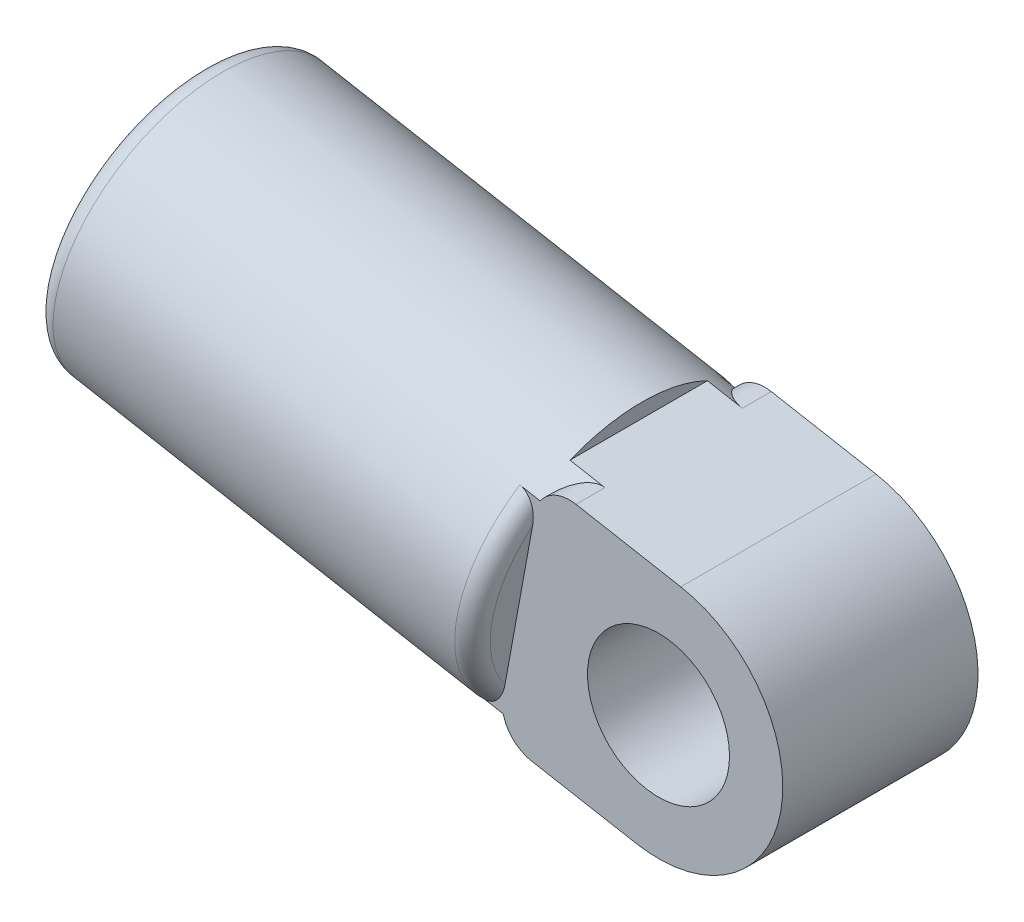
ISO-10303-21;
HEADER;
FILE_DESCRIPTION(('STEP AP214'),'2;1');
FILE_NAME('part.step','',(''),(''),'','','');
FILE_SCHEMA(('AUTOMOTIVE_DESIGN { 1 0 10303 214 1 1 1 1 }'));
ENDSEC;
DATA;
#1=APPLICATION_CONTEXT('core data for automotive mechanical design processes');
#2=APPLICATION_PROTOCOL_DEFINITION('international standard','automotive_design',2000,#1);
#3=PRODUCT_CONTEXT('',#1,'mechanical');
#4=PRODUCT('Part','Part','',(#3));
#5=PRODUCT_RELATED_PRODUCT_CATEGORY('part','',(#4));
#6=PRODUCT_DEFINITION_FORMATION('','',#4);
#7=PRODUCT_DEFINITION_CONTEXT('part definition',#1,'design');
#8=PRODUCT_DEFINITION('design','',#6,#7);
#9=PRODUCT_DEFINITION_SHAPE('','',#8);
#10=(LENGTH_UNIT() NAMED_UNIT(*) SI_UNIT(.MILLI.,.METRE.));
#11=(NAMED_UNIT(*) PLANE_ANGLE_UNIT() SI_UNIT($,.RADIAN.));
#12=(NAMED_UNIT(*) SI_UNIT($,.STERADIAN.) SOLID_ANGLE_UNIT());
#13=UNCERTAINTY_MEASURE_WITH_UNIT(LENGTH_MEASURE(1.E-05),#10,'distance_accuracy_value','');
#14=(GEOMETRIC_REPRESENTATION_CONTEXT(3) GLOBAL_UNCERTAINTY_ASSIGNED_CONTEXT((#13)) GLOBAL_UNIT_ASSIGNED_CONTEXT((#10,
#11,#12)) REPRESENTATION_CONTEXT('',''));
#15=CARTESIAN_POINT('',(0.,0.,0.));
#16=DIRECTION('',(0.,0.,1.));
#17=DIRECTION('',(1.,0.,0.));
#18=AXIS2_PLACEMENT_3D('',#15,#16,#17);
#19=CARTESIAN_POINT('',(178.5,-22.5,5.5));
#20=DIRECTION('',(0.,0.,1.));
#21=DIRECTION('',(1.,0.,0.));
#22=AXIS2_PLACEMENT_3D('',#19,#20,#21);
#23=PLANE('',#22);
#24=DIRECTION('',(0.983797004614952,-0.17928595514052,0.));
#25=VECTOR('',#24,1.);
#26=CARTESIAN_POINT('',(147.076256125409,-10.8682193579792,5.5));
#27=LINE('',#26,#25);
#28=CARTESIAN_POINT('',(171.839542532962,-15.3810501911388,5.5));
#29=VERTEX_POINT('',#28);
#30=CARTESIAN_POINT('',(170.687384236168,-15.1710822813516,5.5));
#31=VERTEX_POINT('',#30);
#32=EDGE_CURVE('E247',#29,#31,#27,.F.);
#33=ORIENTED_EDGE('',*,*,#32,.T.);
#34=CARTESIAN_POINT('',(170.687384236168,-15.1710822813516,5.5));
#35=CARTESIAN_POINT('',(170.709567359835,-15.1751215703482,5.5));
#36=CARTESIAN_POINT('',(170.731547850937,-15.1801989718356,5.5));
#37=CARTESIAN_POINT('',(170.774933255146,-15.1923569855984,5.5));
#38=CARTESIAN_POINT('',(170.796338518701,-15.1994363464552,5.5));
#39=CARTESIAN_POINT('',(170.859131176657,-15.2234450997885,5.5));
#40=CARTESIAN_POINT('',(170.899465360551,-15.2432141598107,5.5));
#41=CARTESIAN_POINT('',(170.976052950081,-15.2892446428313,5.5));
#42=CARTESIAN_POINT('',(171.012314804377,-15.3154922490106,5.5));
#43=CARTESIAN_POINT('',(171.080367049019,-15.3733234521363,5.5));
#44=CARTESIAN_POINT('',(171.112148711703,-15.4049172073886,5.5));
#45=CARTESIAN_POINT('',(171.18141875032,-15.484189241525,5.5));
#46=CARTESIAN_POINT('',(171.216927352727,-15.5335957829678,5.5));
#47=CARTESIAN_POINT('',(171.279476447794,-15.6374602713463,5.5));
#48=CARTESIAN_POINT('',(171.306505479679,-15.6919249270263,5.5));
#49=CARTESIAN_POINT('',(171.361968757601,-15.8263614317351,5.5));
#50=CARTESIAN_POINT('',(171.386683763869,-15.9078603787864,5.5));
#51=CARTESIAN_POINT('',(171.423034939564,-16.0738589253638,5.5));
#52=CARTESIAN_POINT('',(171.434619708439,-16.1583689908957,5.5));
#53=CARTESIAN_POINT('',(171.447226091329,-16.3377569067436,5.5));
#54=CARTESIAN_POINT('',(171.446903190216,-16.432725247939,5.5));
#55=CARTESIAN_POINT('',(171.43765017602,-16.573960631156,5.5));
#56=CARTESIAN_POINT('',(171.433151820406,-16.6205878912566,5.5));
#57=CARTESIAN_POINT('',(171.421494800532,-16.7134638675888,5.5));
#58=CARTESIAN_POINT('',(171.414338761282,-16.7597129114734,5.5));
#59=CARTESIAN_POINT('',(171.405954921548,-16.8057463680579,5.5));
#60=B_SPLINE_CURVE_WITH_KNOTS('',3,(#34,#35,#36,#37,#38,#39,#40,#41,#42,#43,#44,#45,#46,#47,#48,
#49,#50,#51,#52,#53,#54,#55,#56,#57,#58,#59),.UNSPECIFIED.,.F.,.F.,(4,2,2,2,2,2,2,2,2,2,2,2,4),
(0.,0.0675937326948276,0.135145305806319,0.269136656450125,0.40284467570211,0.536809668807584,
0.71833519593357,0.900105021834613,1.15419219100256,1.40927062890769,1.69323005857285,
1.83370200602132,1.97403557580748),.UNSPECIFIED.);
#61=CARTESIAN_POINT('',(171.405954921548,-16.8057463680579,5.5));
#62=VERTEX_POINT('',#61);
#63=EDGE_CURVE('E29',#31,#62,#60,.T.);
#64=ORIENTED_EDGE('',*,*,#63,.T.);
#65=DIRECTION('',(-0.17928595514052,-0.983797004614952,0.));
#66=VECTOR('',#65,1.);
#67=CARTESIAN_POINT('',(171.884625649064,-14.1791333265712,5.5));
#68=LINE('',#67,#66);
#69=CARTESIAN_POINT('',(169.853293004614,-25.3256783496938,5.5));
#70=VERTEX_POINT('',#69);
#71=EDGE_CURVE('E131',#62,#70,#68,.T.);
#72=ORIENTED_EDGE('',*,*,#71,.T.);
#73=CARTESIAN_POINT('',(169.853293004614,-25.3256783496938,5.5));
#74=CARTESIAN_POINT('',(169.841787573011,-25.3887267518417,5.5));
#75=CARTESIAN_POINT('',(169.827982658226,-25.4514010937866,5.5));
#76=CARTESIAN_POINT('',(169.795309762543,-25.575667432973,5.5));
#77=CARTESIAN_POINT('',(169.776422427294,-25.6372543132943,5.5));
#78=CARTESIAN_POINT('',(169.732901757257,-25.7593611973962,5.5));
#79=CARTESIAN_POINT('',(169.708191944323,-25.8198543349024,5.5));
#80=CARTESIAN_POINT('',(169.65273348222,-25.9379057792074,5.5));
#81=CARTESIAN_POINT('',(169.621995605618,-25.9954690939858,5.5));
#82=CARTESIAN_POINT('',(169.552355027426,-26.1092369806614,5.5));
#83=CARTESIAN_POINT('',(169.513137037447,-26.1652512497782,5.5));
#84=CARTESIAN_POINT('',(169.427146042742,-26.270908078276,5.5));
#85=CARTESIAN_POINT('',(169.380403625634,-26.3205750324999,5.5));
#86=CARTESIAN_POINT('',(169.288256602677,-26.4030732276517,5.5));
#87=CARTESIAN_POINT('',(169.24413282431,-26.4373251936279,5.5));
#88=CARTESIAN_POINT('',(169.150870614628,-26.4982662177577,5.5));
#89=CARTESIAN_POINT('',(169.101735395743,-26.5249600798722,5.5));
#90=CARTESIAN_POINT('',(169.00917672196,-26.5645674257359,5.5));
#91=CARTESIAN_POINT('',(168.966466335461,-26.5791422714267,5.5));
#92=CARTESIAN_POINT('',(168.879246364398,-26.6009983368129,5.5));
#93=CARTESIAN_POINT('',(168.834740432944,-26.60829365837,5.5));
#94=CARTESIAN_POINT('',(168.758992674265,-26.6138412986366,5.5));
#95=CARTESIAN_POINT('',(168.727894366258,-26.6141889966035,5.5));
#96=CARTESIAN_POINT('',(168.66584032446,-26.6109573254354,5.5));
#97=CARTESIAN_POINT('',(168.634885017544,-26.6073698476432,5.5));
#98=CARTESIAN_POINT('',(168.604269680764,-26.601770526119,5.5));
#99=B_SPLINE_CURVE_WITH_KNOTS('',3,(#73,#74,#75,#76,#77,#78,#79,#80,#81,#82,#83,#84,#85,#86,#87,
#88,#89,#90,#91,#92,#93,#94,#95,#96,#97,#98),.UNSPECIFIED.,.F.,.F.,(4,2,2,2,2,2,2,2,2,2,2,2,4),
(0.,0.192293227419892,0.385329350833492,0.581058216288106,0.776440436753517,0.980984952802256,
1.18471804862729,1.35168489083902,1.51854536880083,1.65338885619145,1.78797061528234,
1.88103612266413,1.97429375774677),.UNSPECIFIED.);
#100=CARTESIAN_POINT('',(168.604269680764,-26.601770526119,5.5));
#101=VERTEX_POINT('',#100);
#102=EDGE_CURVE('E11',#70,#101,#99,.T.);
#103=ORIENTED_EDGE('',*,*,#102,.T.);
#104=DIRECTION('',(0.983797004614952,-0.17928595514052,0.));
#105=VECTOR('',#104,1.);
#106=CARTESIAN_POINT('',(144.993141570004,-22.2989076027465,5.5));
#107=LINE('',#106,#105);
#108=CARTESIAN_POINT('',(169.756427977558,-26.8117384359061,5.5));
#109=VERTEX_POINT('',#108);
#110=EDGE_CURVE('E249',#109,#101,#107,.F.);
#111=ORIENTED_EDGE('',*,*,#110,.F.);
#112=CARTESIAN_POINT('',(171.700788196608,-26.3432692922316,5.5));
#113=DIRECTION('',(0.,0.,1.));
#114=DIRECTION('',(1.,0.,0.));
#115=AXIS2_PLACEMENT_3D('',#112,#113,#114);
#116=CIRCLE('',#115,2.);
#117=CARTESIAN_POINT('',(171.342216286327,-28.3108633014615,5.5));
#118=VERTEX_POINT('',#117);
#119=EDGE_CURVE('E127',#109,#118,#116,.T.);
#120=ORIENTED_EDGE('',*,*,#119,.T.);
#121=DIRECTION('',(0.983797004614952,-0.179285955140521,0.));
#122=VECTOR('',#121,1.);
#123=CARTESIAN_POINT('',(169.374622277097,-27.9522913911805,5.5));
#124=LINE('',#123,#122);
#125=CARTESIAN_POINT('',(177.244998314017,-29.3865790323046,5.5));
#126=VERTEX_POINT('',#125);
#127=EDGE_CURVE('E119',#118,#126,#124,.T.);
#128=ORIENTED_EDGE('',*,*,#127,.T.);
#129=CARTESIAN_POINT('',(178.5,-22.5,5.5));
#130=DIRECTION('',(0.,0.,1.));
#131=DIRECTION('',(1.,0.,0.));
#132=AXIS2_PLACEMENT_3D('',#129,#130,#131);
#133=CIRCLE('',#132,7.);
#134=CARTESIAN_POINT('',(179.755001685984,-15.6134209676954,5.5));
#135=VERTEX_POINT('',#134);
#136=EDGE_CURVE('E124',#126,#135,#133,.T.);
#137=ORIENTED_EDGE('',*,*,#136,.T.);
#138=DIRECTION('',(-0.983797004614952,0.179285955140521,0.));
#139=VECTOR('',#138,1.);
#140=CARTESIAN_POINT('',(171.884625649064,-14.1791333265712,5.5));
#141=LINE('',#140,#139);
#142=CARTESIAN_POINT('',(173.852219658294,-14.5377052368522,5.5));
#143=VERTEX_POINT('',#142);
#144=EDGE_CURVE('E148',#135,#143,#141,.T.);
#145=ORIENTED_EDGE('',*,*,#144,.T.);
#146=CARTESIAN_POINT('',(173.493647748013,-16.5052992460821,5.5));
#147=DIRECTION('',(0.,0.,1.));
#148=DIRECTION('',(1.,0.,0.));
#149=AXIS2_PLACEMENT_3D('',#146,#147,#148);
#150=CIRCLE('',#149,2.);
#151=EDGE_CURVE('E182',#143,#29,#150,.T.);
#152=ORIENTED_EDGE('',*,*,#151,.T.);
#153=EDGE_LOOP('',(#33,#64,#72,#103,#111,#120,#128,#137,#145,#152));
#154=FACE_BOUND('',#153,.T.);
#155=CARTESIAN_POINT('',(178.5,-22.5,5.5));
#156=DIRECTION('',(0.,0.,1.));
#157=DIRECTION('',(1.,0.,0.));
#158=AXIS2_PLACEMENT_3D('',#155,#156,#157);
#159=CIRCLE('',#158,4.);
#160=CARTESIAN_POINT('',(182.5,-22.5,5.5));
#161=VERTEX_POINT('',#160);
#162=EDGE_CURVE('E157',#161,#161,#159,.T.);
#163=ORIENTED_EDGE('',*,*,#162,.F.);
#164=EDGE_LOOP('',(#163));
#165=FACE_BOUND('',#164,.T.);
#166=ADVANCED_FACE('F17',(#154,#165),#23,.T.);
#167=CARTESIAN_POINT('',(178.5,-22.5,-5.5));
#168=DIRECTION('',(0.,0.,1.));
#169=DIRECTION('',(1.,0.,0.));
#170=AXIS2_PLACEMENT_3D('',#167,#168,#169);
#171=PLANE('',#170);
#172=DIRECTION('',(0.983797004614952,-0.179285955140521,0.));
#173=VECTOR('',#172,1.);
#174=CARTESIAN_POINT('',(169.374622277097,-27.9522913911805,-5.5));
#175=LINE('',#174,#173);
#176=CARTESIAN_POINT('',(171.342216286327,-28.3108633014615,-5.5));
#177=VERTEX_POINT('',#176);
#178=CARTESIAN_POINT('',(177.244998314017,-29.3865790323046,-5.5));
#179=VERTEX_POINT('',#178);
#180=EDGE_CURVE('E139',#177,#179,#175,.T.);
#181=ORIENTED_EDGE('',*,*,#180,.F.);
#182=CARTESIAN_POINT('',(171.700788196608,-26.3432692922316,-5.5));
#183=DIRECTION('',(0.,0.,1.));
#184=DIRECTION('',(1.,0.,0.));
#185=AXIS2_PLACEMENT_3D('',#182,#183,#184);
#186=CIRCLE('',#185,2.);
#187=CARTESIAN_POINT('',(169.756427977558,-26.8117384359061,-5.5));
#188=VERTEX_POINT('',#187);
#189=EDGE_CURVE('E179',#177,#188,#186,.F.);
#190=ORIENTED_EDGE('',*,*,#189,.T.);
#191=DIRECTION('',(0.983797004614952,-0.17928595514052,0.));
#192=VECTOR('',#191,1.);
#193=CARTESIAN_POINT('',(144.993141570004,-22.2989076027465,-5.5));
#194=LINE('',#193,#192);
#195=CARTESIAN_POINT('',(168.604269680764,-26.601770526119,-5.5));
#196=VERTEX_POINT('',#195);
#197=EDGE_CURVE('E251',#188,#196,#194,.F.);
#198=ORIENTED_EDGE('',*,*,#197,.T.);
#199=CARTESIAN_POINT('',(168.604269680764,-26.601770526119,-5.5));
#200=CARTESIAN_POINT('',(168.626451627562,-26.6058162729541,-5.5));
#201=CARTESIAN_POINT('',(168.648810175025,-26.6088191632768,-5.5));
#202=CARTESIAN_POINT('',(168.693695350672,-26.6127474713324,-5.5));
#203=CARTESIAN_POINT('',(168.716221865322,-26.613674183659,-5.5));
#204=CARTESIAN_POINT('',(168.783447152643,-26.6133597406306,-5.5));
#205=CARTESIAN_POINT('',(168.828162149175,-26.6090899385601,-5.5));
#206=CARTESIAN_POINT('',(168.916063963355,-26.5930358019974,-5.5));
#207=CARTESIAN_POINT('',(168.959253812479,-26.5812673764504,-5.5));
#208=CARTESIAN_POINT('',(169.043331837986,-26.5511602064955,-5.5));
#209=CARTESIAN_POINT('',(169.084215431245,-26.5328088780408,-5.5));
#210=CARTESIAN_POINT('',(169.176996472331,-26.4830688331965,-5.5));
#211=CARTESIAN_POINT('',(169.227651085456,-26.4493645700919,-5.5));
#212=CARTESIAN_POINT('',(169.322818534305,-26.3742421505395,-5.5));
#213=CARTESIAN_POINT('',(169.367323012622,-26.3328136737061,-5.5));
#214=CARTESIAN_POINT('',(169.466644814343,-26.2265850113827,-5.5));
#215=CARTESIAN_POINT('',(169.51852069851,-26.1590438939266,-5.5));
#216=CARTESIAN_POINT('',(169.611092944058,-26.0165401929415,-5.5));
#217=CARTESIAN_POINT('',(169.651744901278,-25.9415496840739,-5.5));
#218=CARTESIAN_POINT('',(169.726822093616,-25.7781411150434,-5.5));
#219=CARTESIAN_POINT('',(169.760021170065,-25.689164087573,-5.5));
#220=CARTESIAN_POINT('',(169.801185475733,-25.5537441788335,-5.5));
#221=CARTESIAN_POINT('',(169.813424629678,-25.5085275922925,-5.5));
#222=CARTESIAN_POINT('',(169.835280116056,-25.4175101719422,-5.5));
#223=CARTESIAN_POINT('',(169.84489902033,-25.3717099575481,-5.5));
#224=CARTESIAN_POINT('',(169.853293004614,-25.3256783496937,-5.5));
#225=B_SPLINE_CURVE_WITH_KNOTS('',3,(#199,#200,#201,#202,#203,#204,#205,#206,#207,#208,#209,
#210,#211,#212,#213,#214,#215,#216,#217,#218,#219,#220,#221,#222,#223,#224),.UNSPECIFIED.,.F.,
.F.,(4,2,2,2,2,2,2,2,2,2,2,2,4),(0.,0.0675937326948768,0.135145305806379,0.26913665645022,
0.402844675702174,0.53680966880762,0.718335195933712,0.900105021834838,1.1541921910027,
1.40927062890778,1.69323005857308,1.83370200602159,1.97403557580778),.UNSPECIFIED.);
#226=CARTESIAN_POINT('',(169.853293004614,-25.3256783496937,-5.5));
#227=VERTEX_POINT('',#226);
#228=EDGE_CURVE('E268',#196,#227,#225,.T.);
#229=ORIENTED_EDGE('',*,*,#228,.T.);
#230=DIRECTION('',(-0.17928595514052,-0.983797004614952,0.));
#231=VECTOR('',#230,1.);
#232=CARTESIAN_POINT('',(171.884625649064,-14.1791333265712,-5.5));
#233=LINE('',#232,#231);
#234=CARTESIAN_POINT('',(171.405954921548,-16.8057463680579,-5.5));
#235=VERTEX_POINT('',#234);
#236=EDGE_CURVE('E154',#235,#227,#233,.T.);
#237=ORIENTED_EDGE('',*,*,#236,.F.);
#238=CARTESIAN_POINT('',(171.405954921548,-16.8057463680579,-5.5));
#239=CARTESIAN_POINT('',(171.417430217189,-16.7426924739694,-5.5));
#240=CARTESIAN_POINT('',(171.426621902096,-16.6791774226902,-5.5));
#241=CARTESIAN_POINT('',(171.439885884607,-16.5513740270584,-5.5));
#242=CARTESIAN_POINT('',(171.443938267038,-16.4870836431962,-5.5));
#243=CARTESIAN_POINT('',(171.446290071428,-16.3574741956946,-5.5));
#244=CARTESIAN_POINT('',(171.444508454385,-16.2921532925983,-5.5));
#245=CARTESIAN_POINT('',(171.434259305506,-16.162127374149,-5.5));
#246=CARTESIAN_POINT('',(171.425803620326,-16.0974214729159,-5.5));
#247=CARTESIAN_POINT('',(171.400773003508,-15.966400824195,-5.5));
#248=CARTESIAN_POINT('',(171.383835920813,-15.9001529237568,-5.5));
#249=CARTESIAN_POINT('',(171.340644732324,-15.7709540932072,-5.5));
#250=CARTESIAN_POINT('',(171.314427853336,-15.7079911266702,-5.5));
#251=CARTESIAN_POINT('',(171.25730690346,-15.598290519887,-5.5));
#252=CARTESIAN_POINT('',(171.228102497387,-15.55067531584,-5.5));
#253=CARTESIAN_POINT('',(171.162333502547,-15.4607526407536,-5.5));
#254=CARTESIAN_POINT('',(171.125773614351,-15.4184418078088,-5.5));
#255=CARTESIAN_POINT('',(171.053137216864,-15.3487295154997,-5.5));
#256=CARTESIAN_POINT('',(171.018314000325,-15.3200250414294,-5.5));
#257=CARTESIAN_POINT('',(170.944411120176,-15.2688061459683,-5.5));
#258=CARTESIAN_POINT('',(170.905339849431,-15.24627981796,-5.5));
#259=CARTESIAN_POINT('',(170.836418676418,-15.2143678896583,-5.5));
#260=CARTESIAN_POINT('',(170.807442237079,-15.2030722436825,-5.5));
#261=CARTESIAN_POINT('',(170.74823744703,-15.1842058545957,-5.5));
#262=CARTESIAN_POINT('',(170.718006635325,-15.1766428494457,-5.5));
#263=CARTESIAN_POINT('',(170.687384236168,-15.1710822813516,-5.5));
#264=B_SPLINE_CURVE_WITH_KNOTS('',3,(#238,#239,#240,#241,#242,#243,#244,#245,#246,#247,#248,
#249,#250,#251,#252,#253,#254,#255,#256,#257,#258,#259,#260,#261,#262,#263),.UNSPECIFIED.,.F.,
.F.,(4,2,2,2,2,2,2,2,2,2,2,2,4),(0.,0.192293227419827,0.38532935083335,0.581058216288006,
0.776440436753476,0.9809849528022,1.18471804862715,1.35168489083899,1.51854536880097,
1.6533888561916,1.78797061528247,1.88103612266412,1.97429375774654),.UNSPECIFIED.);
#265=CARTESIAN_POINT('',(170.687384236168,-15.1710822813516,-5.5));
#266=VERTEX_POINT('',#265);
#267=EDGE_CURVE('E274',#235,#266,#264,.T.);
#268=ORIENTED_EDGE('',*,*,#267,.T.);
#269=DIRECTION('',(0.983797004614952,-0.17928595514052,0.));
#270=VECTOR('',#269,1.);
#271=CARTESIAN_POINT('',(147.076256125409,-10.8682193579792,-5.5));
#272=LINE('',#271,#270);
#273=CARTESIAN_POINT('',(171.839542532962,-15.3810501911388,-5.5));
#274=VERTEX_POINT('',#273);
#275=EDGE_CURVE('E245',#274,#266,#272,.F.);
#276=ORIENTED_EDGE('',*,*,#275,.F.);
#277=CARTESIAN_POINT('',(173.493647748013,-16.5052992460821,-5.5));
#278=DIRECTION('',(0.,0.,1.));
#279=DIRECTION('',(1.,0.,0.));
#280=AXIS2_PLACEMENT_3D('',#277,#278,#279);
#281=CIRCLE('',#280,2.);
#282=CARTESIAN_POINT('',(173.852219658294,-14.5377052368522,-5.5));
#283=VERTEX_POINT('',#282);
#284=EDGE_CURVE('E177',#274,#283,#281,.F.);
#285=ORIENTED_EDGE('',*,*,#284,.T.);
#286=DIRECTION('',(-0.983797004614952,0.179285955140521,0.));
#287=VECTOR('',#286,1.);
#288=CARTESIAN_POINT('',(171.884625649064,-14.1791333265712,-5.5));
#289=LINE('',#288,#287);
#290=CARTESIAN_POINT('',(179.755001685984,-15.6134209676954,-5.5));
#291=VERTEX_POINT('',#290);
#292=EDGE_CURVE('E161',#291,#283,#289,.T.);
#293=ORIENTED_EDGE('',*,*,#292,.F.);
#294=CARTESIAN_POINT('',(178.5,-22.5,-5.5));
#295=DIRECTION('',(0.,0.,1.));
#296=DIRECTION('',(1.,0.,0.));
#297=AXIS2_PLACEMENT_3D('',#294,#295,#296);
#298=CIRCLE('',#297,7.);
#299=EDGE_CURVE('E159',#179,#291,#298,.T.);
#300=ORIENTED_EDGE('',*,*,#299,.F.);
#301=EDGE_LOOP('',(#181,#190,#198,#229,#237,#268,#276,#285,#293,#300));
#302=FACE_BOUND('',#301,.T.);
#303=CARTESIAN_POINT('',(178.5,-22.5,-5.5));
#304=DIRECTION('',(0.,0.,1.));
#305=DIRECTION('',(1.,0.,0.));
#306=AXIS2_PLACEMENT_3D('',#303,#304,#305);
#307=CIRCLE('',#306,4.);
#308=CARTESIAN_POINT('',(182.5,-22.5,-5.5));
#309=VERTEX_POINT('',#308);
#310=EDGE_CURVE('E316',#309,#309,#307,.T.);
#311=ORIENTED_EDGE('',*,*,#310,.T.);
#312=EDGE_LOOP('',(#311));
#313=FACE_BOUND('',#312,.T.);
#314=ADVANCED_FACE('F278',(#302,#313),#171,.F.);
#315=CARTESIAN_POINT('',(169.374622277097,-27.9522913911805,5.5));
#316=DIRECTION('',(0.179285955140521,0.983797004614952,0.));
#317=DIRECTION('',(-0.983797004614952,0.179285955140521,0.));
#318=AXIS2_PLACEMENT_3D('',#315,#316,#317);
#319=PLANE('',#318);
#320=DIRECTION('',(0.983797004614952,-0.17928595514052,0.));
#321=VECTOR('',#320,1.);
#322=CARTESIAN_POINT('',(169.374622277097,-27.9522913911806,-3.87298334620739));
#323=LINE('',#322,#321);
#324=CARTESIAN_POINT('',(169.374622277097,-27.9522913911806,-3.87298334620739));
#325=VERTEX_POINT('',#324);
#326=CARTESIAN_POINT('',(171.342216286327,-28.3108633014615,-3.87298334620739));
#327=VERTEX_POINT('',#326);
#328=EDGE_CURVE('E173',#325,#327,#323,.T.);
#329=ORIENTED_EDGE('',*,*,#328,.T.);
#330=DIRECTION('',(0.,0.,-1.));
#331=VECTOR('',#330,1.);
#332=CARTESIAN_POINT('',(171.342216286327,-28.3108633014615,5.5));
#333=LINE('',#332,#331);
#334=EDGE_CURVE('E175',#327,#177,#333,.T.);
#335=ORIENTED_EDGE('',*,*,#334,.T.);
#336=ORIENTED_EDGE('',*,*,#180,.T.);
#337=DIRECTION('',(0.,0.,-1.));
#338=VECTOR('',#337,1.);
#339=CARTESIAN_POINT('',(177.244998314017,-29.3865790323046,5.5));
#340=LINE('',#339,#338);
#341=EDGE_CURVE('E134',#126,#179,#340,.T.);
#342=ORIENTED_EDGE('',*,*,#341,.F.);
#343=ORIENTED_EDGE('',*,*,#127,.F.);
#344=DIRECTION('',(0.,0.,-1.));
#345=VECTOR('',#344,1.);
#346=CARTESIAN_POINT('',(171.342216286327,-28.3108633014615,5.5));
#347=LINE('',#346,#345);
#348=CARTESIAN_POINT('',(171.342216286327,-28.3108633014615,3.8729833462074));
#349=VERTEX_POINT('',#348);
#350=EDGE_CURVE('E171',#118,#349,#347,.T.);
#351=ORIENTED_EDGE('',*,*,#350,.T.);
#352=DIRECTION('',(0.983797004614952,-0.17928595514052,0.));
#353=VECTOR('',#352,1.);
#354=CARTESIAN_POINT('',(171.342216286327,-28.3108633014615,3.8729833462074));
#355=LINE('',#354,#353);
#356=CARTESIAN_POINT('',(169.374622277097,-27.9522913911806,3.8729833462074));
#357=VERTEX_POINT('',#356);
#358=EDGE_CURVE('E169',#349,#357,#355,.F.);
#359=ORIENTED_EDGE('',*,*,#358,.T.);
#360=DIRECTION('',(0.,0.,-1.));
#361=VECTOR('',#360,1.);
#362=CARTESIAN_POINT('',(169.374622277097,-27.9522913911805,5.5));
#363=LINE('',#362,#361);
#364=EDGE_CURVE('E142',#357,#325,#363,.T.);
#365=ORIENTED_EDGE('',*,*,#364,.T.);
#366=EDGE_LOOP('',(#329,#335,#336,#342,#343,#351,#359,#365));
#367=FACE_BOUND('',#366,.T.);
#368=ADVANCED_FACE('F136',(#367),#319,.F.);
#369=CARTESIAN_POINT('',(178.5,-22.5,5.5));
#370=DIRECTION('',(0.,0.,-1.));
#371=DIRECTION('',(-1.,0.,0.));
#372=AXIS2_PLACEMENT_3D('',#369,#370,#371);
#373=CYLINDRICAL_SURFACE('',#372,7.);
#374=ORIENTED_EDGE('',*,*,#299,.T.);
#375=DIRECTION('',(0.,0.,-1.));
#376=VECTOR('',#375,1.);
#377=CARTESIAN_POINT('',(179.755001685984,-15.6134209676954,5.5));
#378=LINE('',#377,#376);
#379=EDGE_CURVE('E143',#135,#291,#378,.T.);
#380=ORIENTED_EDGE('',*,*,#379,.F.);
#381=ORIENTED_EDGE('',*,*,#136,.F.);
#382=ORIENTED_EDGE('',*,*,#341,.T.);
#383=EDGE_LOOP('',(#374,#380,#381,#382));
#384=FACE_BOUND('',#383,.T.);
#385=ADVANCED_FACE('F145',(#384),#373,.T.);
#386=CARTESIAN_POINT('',(171.884625649064,-14.1791333265712,5.5));
#387=DIRECTION('',(-0.179285955140521,-0.983797004614952,0.));
#388=DIRECTION('',(0.983797004614952,-0.179285955140521,0.));
#389=AXIS2_PLACEMENT_3D('',#386,#387,#388);
#390=PLANE('',#389);
#391=DIRECTION('',(0.,0.,-1.));
#392=VECTOR('',#391,1.);
#393=CARTESIAN_POINT('',(171.884625649064,-14.1791333265712,5.5));
#394=LINE('',#393,#392);
#395=CARTESIAN_POINT('',(171.884625649064,-14.1791333265712,3.87298334620743));
#396=VERTEX_POINT('',#395);
#397=CARTESIAN_POINT('',(171.884625649064,-14.1791333265712,-3.87298334620742));
#398=VERTEX_POINT('',#397);
#399=EDGE_CURVE('E150',#396,#398,#394,.T.);
#400=ORIENTED_EDGE('',*,*,#399,.F.);
#401=DIRECTION('',(0.983797004614952,-0.17928595514052,0.));
#402=VECTOR('',#401,1.);
#403=CARTESIAN_POINT('',(171.884625649064,-14.1791333265712,3.87298334620743));
#404=LINE('',#403,#402);
#405=CARTESIAN_POINT('',(173.852219658294,-14.5377052368522,3.87298334620743));
#406=VERTEX_POINT('',#405);
#407=EDGE_CURVE('E194',#396,#406,#404,.T.);
#408=ORIENTED_EDGE('',*,*,#407,.T.);
#409=DIRECTION('',(0.,0.,-1.));
#410=VECTOR('',#409,1.);
#411=CARTESIAN_POINT('',(173.852219658294,-14.5377052368522,5.5));
#412=LINE('',#411,#410);
#413=EDGE_CURVE('E191',#406,#143,#412,.F.);
#414=ORIENTED_EDGE('',*,*,#413,.T.);
#415=ORIENTED_EDGE('',*,*,#144,.F.);
#416=ORIENTED_EDGE('',*,*,#379,.T.);
#417=ORIENTED_EDGE('',*,*,#292,.T.);
#418=DIRECTION('',(0.,0.,-1.));
#419=VECTOR('',#418,1.);
#420=CARTESIAN_POINT('',(173.852219658294,-14.5377052368522,5.5));
#421=LINE('',#420,#419);
#422=CARTESIAN_POINT('',(173.852219658294,-14.5377052368522,-3.87298334620743));
#423=VERTEX_POINT('',#422);
#424=EDGE_CURVE('E188',#283,#423,#421,.F.);
#425=ORIENTED_EDGE('',*,*,#424,.T.);
#426=DIRECTION('',(0.983797004614952,-0.17928595514052,0.));
#427=VECTOR('',#426,1.);
#428=CARTESIAN_POINT('',(173.852219658294,-14.5377052368522,-3.87298334620743));
#429=LINE('',#428,#427);
#430=EDGE_CURVE('E186',#423,#398,#429,.F.);
#431=ORIENTED_EDGE('',*,*,#430,.T.);
#432=EDGE_LOOP('',(#400,#408,#414,#415,#416,#417,#425,#431));
#433=FACE_BOUND('',#432,.T.);
#434=ADVANCED_FACE('F300',(#433),#390,.F.);
#435=CARTESIAN_POINT('',(178.5,-22.5,5.5));
#436=DIRECTION('',(0.,0.,-1.));
#437=DIRECTION('',(-1.,0.,0.));
#438=AXIS2_PLACEMENT_3D('',#435,#436,#437);
#439=CYLINDRICAL_SURFACE('',#438,4.);
#440=ORIENTED_EDGE('',*,*,#162,.T.);
#441=EDGE_LOOP('',(#440));
#442=FACE_BOUND('',#441,.T.);
#443=ORIENTED_EDGE('',*,*,#310,.F.);
#444=EDGE_LOOP('',(#443));
#445=FACE_BOUND('',#444,.T.);
#446=ADVANCED_FACE('F296',(#442,#445),#439,.F.);
#447=CARTESIAN_POINT('',(170.629623963081,-21.0657123588759,0.));
#448=DIRECTION('',(-0.983797004614952,0.17928595514052,0.));
#449=DIRECTION('',(-0.17928595514052,-0.983797004614952,0.));
#450=AXIS2_PLACEMENT_3D('',#447,#448,#449);
#451=PLANE('',#450);
#452=ORIENTED_EDGE('',*,*,#236,.T.);
#453=CARTESIAN_POINT('',(170.629623963081,-21.0657123588759,0.));
#454=DIRECTION('',(-0.983797004614952,0.17928595514052,0.));
#455=DIRECTION('',(-0.17928595514052,-0.983797004614952,0.));
#456=AXIS2_PLACEMENT_3D('',#453,#454,#455);
#457=CIRCLE('',#456,7.);
#458=EDGE_CURVE('E262',#227,#235,#457,.F.);
#459=ORIENTED_EDGE('',*,*,#458,.T.);
#460=EDGE_LOOP('',(#452,#459));
#461=FACE_BOUND('',#460,.T.);
#462=ADVANCED_FACE('F299',(#461),#451,.F.);
#463=ORIENTED_EDGE('',*,*,#364,.F.);
#464=CARTESIAN_POINT('',(170.629623963081,-21.0657123588759,0.));
#465=DIRECTION('',(-0.983797004614952,0.17928595514052,0.));
#466=DIRECTION('',(-0.17928595514052,-0.983797004614952,0.));
#467=AXIS2_PLACEMENT_3D('',#464,#465,#466);
#468=CIRCLE('',#467,8.);
#469=EDGE_CURVE('E322',#325,#357,#468,.T.);
#470=ORIENTED_EDGE('',*,*,#469,.F.);
#471=EDGE_LOOP('',(#463,#470));
#472=FACE_BOUND('',#471,.T.);
#473=ADVANCED_FACE('F307',(#472),#451,.F.);
#474=EDGE_CURVE('E318',#396,#398,#468,.T.);
#475=ORIENTED_EDGE('',*,*,#474,.F.);
#476=ORIENTED_EDGE('',*,*,#399,.T.);
#477=EDGE_LOOP('',(#475,#476));
#478=FACE_BOUND('',#477,.T.);
#479=ADVANCED_FACE('F351',(#478),#451,.F.);
#480=CARTESIAN_POINT('',(146.034698847707,-16.5835634803628,0.));
#481=DIRECTION('',(0.983797004614952,-0.17928595514052,0.));
#482=DIRECTION('',(0.17928595514052,0.983797004614952,0.));
#483=AXIS2_PLACEMENT_3D('',#480,#481,#482);
#484=CYLINDRICAL_SURFACE('',#483,8.);
#485=CARTESIAN_POINT('',(147.018495852322,-16.7628494355034,0.));
#486=DIRECTION('',(-0.983797004614952,0.17928595514052,0.));
#487=DIRECTION('',(-0.17928595514052,-0.983797004614952,0.));
#488=AXIS2_PLACEMENT_3D('',#485,#486,#487);
#489=CIRCLE('',#488,8.);
#490=CARTESIAN_POINT('',(145.584208211197,-24.633225472423,0.));
#491=VERTEX_POINT('',#490);
#492=EDGE_CURVE('E253',#491,#491,#489,.F.);
#493=ORIENTED_EDGE('',*,*,#492,.T.);
#494=EDGE_LOOP('',(#493));
#495=FACE_BOUND('',#494,.T.);
#496=CARTESIAN_POINT('',(169.645826958466,-20.8864264037353,0.));
#497=DIRECTION('',(-0.983797004614952,0.17928595514052,0.));
#498=DIRECTION('',(-0.17928595514052,-0.983797004614952,0.));
#499=AXIS2_PLACEMENT_3D('',#496,#497,#498);
#500=CIRCLE('',#499,8.);
#501=EDGE_CURVE('E259',#266,#196,#500,.T.);
#502=ORIENTED_EDGE('',*,*,#501,.T.);
#503=ORIENTED_EDGE('',*,*,#197,.F.);
#504=CARTESIAN_POINT('',(169.733194187378,-25.9846973819506,-6.24499799839839));
#505=CARTESIAN_POINT('',(169.721335968571,-26.0498134705441,-6.1920171245834));
#506=CARTESIAN_POINT('',(169.7128510919,-26.1146463969899,-6.13799502366123));
#507=CARTESIAN_POINT('',(169.7022444881,-26.2433032026463,-6.02825582445937));
#508=CARTESIAN_POINT('',(169.70011736301,-26.3071278920557,-5.97254020466738));
#509=CARTESIAN_POINT('',(169.701822719312,-26.4333494574043,-5.85978885126416));
#510=CARTESIAN_POINT('',(169.70564690416,-26.4957481982162,-5.80275506442174));
#511=CARTESIAN_POINT('',(169.718909486427,-26.6189397751365,-5.687623109233));
#512=CARTESIAN_POINT('',(169.728349404979,-26.6797321714731,-5.6295246566348));
#513=CARTESIAN_POINT('',(169.767717787865,-26.8744917454638,-5.43931881227633));
#514=CARTESIAN_POINT('',(169.808504100615,-27.004864438759,-5.30554673506542));
#515=CARTESIAN_POINT('',(169.888625943876,-27.1921993889659,-5.10502610198572));
#516=CARTESIAN_POINT('',(169.91852401477,-27.2533224793543,-5.03815162010711));
#517=CARTESIAN_POINT('',(169.98472000662,-27.3727187784711,-4.90502623669124));
#518=CARTESIAN_POINT('',(170.021016012483,-27.4309928333523,-4.83877515478525));
#519=CARTESIAN_POINT('',(170.113300490597,-27.5632597453139,-4.68600932204375));
#520=CARTESIAN_POINT('',(170.171835730664,-27.6360985108812,-4.60001740488756));
#521=CARTESIAN_POINT('',(170.301833996535,-27.775758865933,-4.43320504215523));
#522=CARTESIAN_POINT('',(170.373268524702,-27.842593242647,-4.352373718021));
#523=CARTESIAN_POINT('',(170.501439718147,-27.9449835783666,-4.22945944090539));
#524=CARTESIAN_POINT('',(170.553445506687,-27.982773999211,-4.18432467649768));
#525=CARTESIAN_POINT('',(170.664218902785,-28.0549626467237,-4.0997877297666));
#526=CARTESIAN_POINT('',(170.722986845977,-28.0893607048582,-4.06038583220801));
#527=CARTESIAN_POINT('',(170.838501508192,-28.1488235001362,-3.99548473267516));
#528=CARTESIAN_POINT('',(170.894238666868,-28.1745148699681,-3.96878795861962));
#529=CARTESIAN_POINT('',(171.010733109519,-28.2214946815614,-3.92412020234069));
#530=CARTESIAN_POINT('',(171.071470163962,-28.2427997523324,-3.90611590290141));
#531=CARTESIAN_POINT('',(171.167844926823,-28.2712770278121,-3.8868440369821));
#532=CARTESIAN_POINT('',(171.20214359475,-28.2804363629264,-3.88168711981662));
#533=CARTESIAN_POINT('',(171.271628145557,-28.2970119616095,-3.87473931427577));
#534=CARTESIAN_POINT('',(171.306816859637,-28.304421598725,-3.87296104798021));
#535=CARTESIAN_POINT('',(171.342216286327,-28.3108633014615,-3.8729833462074));
#536=B_SPLINE_CURVE_WITH_KNOTS('',3,(#504,#505,#506,#507,#508,#509,#510,#511,#512,#513,#514,
#515,#516,#517,#518,#519,#520,#521,#522,#523,#524,#525,#526,#527,#528,#529,#530,#531,#532,#533,
#534,#535),.UNSPECIFIED.,.F.,.F.,(4,2,2,2,2,2,2,2,2,2,2,2,2,2,2,4),(0.,0.2542094899076,
0.50820308542469,0.761842913150411,1.01555147557555,1.58663651009588,1.87266912871176,
2.15861627412987,2.53886624240364,2.91828620196849,3.15351777255674,3.38876102365558,
3.5888618158372,3.78818943377024,3.89561451052072,4.00344012644964),.UNSPECIFIED.);
#537=EDGE_CURVE('E197',#188,#327,#536,.T.);
#538=ORIENTED_EDGE('',*,*,#537,.T.);
#539=ORIENTED_EDGE('',*,*,#328,.F.);
#540=ORIENTED_EDGE('',*,*,#469,.T.);
#541=ORIENTED_EDGE('',*,*,#358,.F.);
#542=CARTESIAN_POINT('',(171.342216286327,-28.3108633014615,3.8729833462074));
#543=CARTESIAN_POINT('',(171.312627018632,-28.3054754460615,3.87297286417621));
#544=CARTESIAN_POINT('',(171.283178293331,-28.2994142764597,3.87421044605527));
#545=CARTESIAN_POINT('',(171.224809387483,-28.2860343126458,3.87908270266398));
#546=CARTESIAN_POINT('',(171.195888551689,-28.2787172141816,3.88271416373093));
#547=CARTESIAN_POINT('',(171.110827305415,-28.2551727756431,3.89694629809902));
#548=CARTESIAN_POINT('',(171.055698459834,-28.2372243858237,3.91088955982142));
#549=CARTESIAN_POINT('',(170.93327981703,-28.1916221272406,3.95153675435796));
#550=CARTESIAN_POINT('',(170.867360034113,-28.1626749628924,3.9808257239317));
#551=CARTESIAN_POINT('',(170.742482969259,-28.1001314650272,4.04829246380181));
#552=CARTESIAN_POINT('',(170.683556043029,-28.066516144719,4.08650699333993));
#553=CARTESIAN_POINT('',(170.573077945034,-27.9962959517374,4.16831676973312));
#554=CARTESIAN_POINT('',(170.521443383914,-27.9597339605765,4.21183835702145));
#555=CARTESIAN_POINT('',(170.418885323758,-27.8799461483333,4.30746675590689));
#556=CARTESIAN_POINT('',(170.36859419506,-27.8364227385441,4.35999570377208));
#557=CARTESIAN_POINT('',(170.274193905251,-27.7465079404623,4.46812373513176));
#558=CARTESIAN_POINT('',(170.23009060045,-27.7001138943622,4.52372565852844));
#559=CARTESIAN_POINT('',(170.147277624003,-27.6044707325939,4.6372074927201));
#560=CARTESIAN_POINT('',(170.10860244768,-27.5552059454356,4.69509921763233));
#561=CARTESIAN_POINT('',(170.036581698565,-27.4542423523032,4.81207397396991));
#562=CARTESIAN_POINT('',(170.003237499691,-27.4025429232951,4.8711573080966));
#563=CARTESIAN_POINT('',(169.933126221599,-27.2821426067157,5.0064429960015));
#564=CARTESIAN_POINT('',(169.89798305061,-27.2127096841111,5.08283980588434));
#565=CARTESIAN_POINT('',(169.835985458164,-27.0702788391336,5.23572391287299));
#566=CARTESIAN_POINT('',(169.809134352749,-26.9972795040138,5.31221123393223));
#567=CARTESIAN_POINT('',(169.764054904396,-26.8483328820957,5.46414676246321));
#568=CARTESIAN_POINT('',(169.74578730208,-26.7724007709434,5.53959813787858));
#569=CARTESIAN_POINT('',(169.718137470035,-26.6176289029813,5.68912719022259));
#570=CARTESIAN_POINT('',(169.70875383585,-26.5387896078128,5.7632050824676));
#571=CARTESIAN_POINT('',(169.699662707558,-26.3815926076737,5.90665829101797));
#572=CARTESIAN_POINT('',(169.699614435116,-26.3033224173097,5.97610655317699));
#573=CARTESIAN_POINT('',(169.709056341836,-26.1450886742113,6.11256596857345));
#574=CARTESIAN_POINT('',(169.718558674647,-26.0651230909235,6.17957390377983));
#575=CARTESIAN_POINT('',(169.733194187378,-25.9846973819506,6.24499799839839));
#576=B_SPLINE_CURVE_WITH_KNOTS('',3,(#542,#543,#544,#545,#546,#547,#548,#549,#550,#551,#552,
#553,#554,#555,#556,#557,#558,#559,#560,#561,#562,#563,#564,#565,#566,#567,#568,#569,#570,#571,
#572,#573,#574,#575),.UNSPECIFIED.,.F.,.F.,(4,2,2,2,2,2,2,2,2,2,2,2,2,2,2,2,4),(0.,
0.0901624620301699,0.180204131298895,0.358214399266694,0.590106929086208,0.822971876496079,
1.0529102304989,1.30676097789564,1.56085037825104,1.81648771383902,2.07219082728963,
2.39895395803969,2.72584759444546,3.05123116433294,3.37656328611199,3.69001714648619,
4.0038703991782),.UNSPECIFIED.);
#577=EDGE_CURVE('E204',#349,#109,#576,.T.);
#578=ORIENTED_EDGE('',*,*,#577,.T.);
#579=ORIENTED_EDGE('',*,*,#110,.T.);
#580=CARTESIAN_POINT('',(169.645826958466,-20.8864264037353,0.));
#581=DIRECTION('',(-0.983797004614952,0.17928595514052,0.));
#582=DIRECTION('',(-0.17928595514052,-0.983797004614952,0.));
#583=AXIS2_PLACEMENT_3D('',#580,#581,#582);
#584=CIRCLE('',#583,8.);
#585=EDGE_CURVE('E256',#101,#31,#584,.T.);
#586=ORIENTED_EDGE('',*,*,#585,.T.);
#587=ORIENTED_EDGE('',*,*,#32,.F.);
#588=CARTESIAN_POINT('',(171.526053738783,-16.1467273358011,6.24499799839841));
#589=CARTESIAN_POINT('',(171.537928327965,-16.0816142305246,6.19201712458344));
#590=CARTESIAN_POINT('',(171.552859508712,-16.0179560705987,6.13799502366127));
#591=CARTESIAN_POINT('',(171.588319999049,-15.8938286066315,6.02825582445942));
#592=CARTESIAN_POINT('',(171.608844543505,-15.8333566402817,5.97254020466744));
#593=CARTESIAN_POINT('',(171.654966435934,-15.7158510538699,5.85978885126421));
#594=CARTESIAN_POINT('',(171.680556678578,-15.6588127621174,5.8027550644218));
#595=CARTESIAN_POINT('',(171.736423953966,-15.5482193253623,5.68762310923304));
#596=CARTESIAN_POINT('',(171.766702254918,-15.494665128458,5.62952465663484));
#597=CARTESIAN_POINT('',(171.872243537463,-15.3263137135224,5.43931881227637));
#598=CARTESIAN_POINT('',(171.956398352588,-15.2187101375779,5.30554673506547));
#599=CARTESIAN_POINT('',(172.097454056653,-15.0716823113429,5.10502610198585));
#600=CARTESIAN_POINT('',(172.146991974887,-15.0250355378333,5.03815162010727));
#601=CARTESIAN_POINT('',(172.251050904976,-14.9366662861196,4.90502623669134));
#602=CARTESIAN_POINT('',(172.305570423344,-14.8949423405871,4.83877515478525));
#603=CARTESIAN_POINT('',(172.438580954355,-14.803732913767,4.6860093220438));
#604=CARTESIAN_POINT('',(172.51904789139,-14.7562257338537,4.60001740488786));
#605=CARTESIAN_POINT('',(172.689955832934,-14.6714021556483,4.43320504215552));
#606=CARTESIAN_POINT('',(172.78037468268,-14.6340637392957,4.35237371802104));
#607=CARTESIAN_POINT('',(172.936425563147,-14.5834696844697,4.22945944090555));
#608=CARTESIAN_POINT('',(172.998419083726,-14.5664543573945,4.184324676498));
#609=CARTESIAN_POINT('',(173.127536610365,-14.5379831363537,4.09978772976689));
#610=CARTESIAN_POINT('',(173.194660871028,-14.5265275184858,4.06038583220811));
#611=CARTESIAN_POINT('',(173.323725665727,-14.5116365823767,3.99548473267522));
#612=CARTESIAN_POINT('',(173.38494259311,-14.5072587812265,3.96878795861979));
#613=CARTESIAN_POINT('',(173.51052065926,-14.504393965664,3.92412020234086));
#614=CARTESIAN_POINT('',(173.57486873507,-14.5058842550598,3.90611590290148));
#615=CARTESIAN_POINT('',(173.675093562308,-14.5132350468804,3.88684403698213));
#616=CARTESIAN_POINT('',(173.710418340056,-14.5167638028046,3.88168711981666));
#617=CARTESIAN_POINT('',(173.781283184845,-14.5257653052152,3.87473931427583));
#618=CARTESIAN_POINT('',(173.816823563515,-14.5312452509002,3.87296104798027));
#619=CARTESIAN_POINT('',(173.852219658294,-14.5377052368522,3.87298334620744));
#620=B_SPLINE_CURVE_WITH_KNOTS('',3,(#588,#589,#590,#591,#592,#593,#594,#595,#596,#597,#598,
#599,#600,#601,#602,#603,#604,#605,#606,#607,#608,#609,#610,#611,#612,#613,#614,#615,#616,#617,
#618,#619),.UNSPECIFIED.,.F.,.F.,(4,2,2,2,2,2,2,2,2,2,2,2,2,2,2,4),(0.,0.254209489907545,
0.508203085424622,0.761842913150366,1.01555147557552,1.58663651009577,1.8726691287116,
2.15861627412963,2.53886624240326,2.91828620196801,3.15351777255631,3.38876102365516,
3.5888618158369,3.78818943377003,3.89561451052063,4.00344012644966),.UNSPECIFIED.);
#621=EDGE_CURVE('E234',#29,#406,#620,.T.);
#622=ORIENTED_EDGE('',*,*,#621,.T.);
#623=ORIENTED_EDGE('',*,*,#407,.F.);
#624=ORIENTED_EDGE('',*,*,#474,.T.);
#625=ORIENTED_EDGE('',*,*,#430,.F.);
#626=CARTESIAN_POINT('',(173.852219658294,-14.5377052368522,-3.87298334620743));
#627=CARTESIAN_POINT('',(173.82263196262,-14.5323087552903,-3.87297286417622));
#628=CARTESIAN_POINT('',(173.79293825466,-14.5275918806545,-3.87421044605528));
#629=CARTESIAN_POINT('',(173.733601762848,-14.5195213576856,-3.879082702664));
#630=CARTESIAN_POINT('',(173.703958964069,-14.5161658914725,-3.88271416373096));
#631=CARTESIAN_POINT('',(173.616060459708,-14.5081903579558,-3.89694629809904));
#632=CARTESIAN_POINT('',(173.558144167745,-14.5055375410593,-3.91088955982142));
#633=CARTESIAN_POINT('',(173.427508698265,-14.5050235297103,-3.95153675435797));
#634=CARTESIAN_POINT('',(173.355615235572,-14.5088557778165,-3.98082572393177));
#635=CARTESIAN_POINT('',(173.216703163428,-14.52332666806,-4.04829246380188));
#636=CARTESIAN_POINT('',(173.149706260392,-14.5339937847256,-4.08650699333994));
#637=CARTESIAN_POINT('',(173.021559443955,-14.5607272670304,-4.16831676973311));
#638=CARTESIAN_POINT('',(172.960346629011,-14.5767240912841,-4.21183835702146));
#639=CARTESIAN_POINT('',(172.836235603442,-14.6152040083575,-4.30746675590693));
#640=CARTESIAN_POINT('',(172.773824132045,-14.6381886350337,-4.35999570377214));
#641=CARTESIAN_POINT('',(172.65377402351,-14.6890222564939,-4.46812373513184));
#642=CARTESIAN_POINT('',(172.596139928624,-14.7168758041062,-4.52372565852851));
#643=CARTESIAN_POINT('',(172.484911472043,-14.77715709397,-4.63720749272016));
#644=CARTESIAN_POINT('',(172.431343859767,-14.809611668878,-4.69509921763239));
#645=CARTESIAN_POINT('',(172.328336985743,-14.8786784434154,-4.81207397396995));
#646=CARTESIAN_POINT('',(172.278898789804,-14.9152917106914,-4.87115730809663));
#647=CARTESIAN_POINT('',(172.170822095937,-15.0032192705972,-5.00644299600152));
#648=CARTESIAN_POINT('',(172.113444876079,-15.0557913910596,-5.08283980588437));
#649=CARTESIAN_POINT('',(172.005188731475,-15.1671954045666,-5.23572391287303));
#650=CARTESIAN_POINT('',(171.954312411229,-15.2260297893108,-5.31221123393227));
#651=CARTESIAN_POINT('',(171.859588277236,-15.3494987784699,-5.46414676246327));
#652=CARTESIAN_POINT('',(171.815709081366,-15.4141053336187,-5.53959813787866));
#653=CARTESIAN_POINT('',(171.735239142274,-15.5491735875762,-5.68912719022266));
#654=CARTESIAN_POINT('',(171.698647247734,-15.6196343589821,-5.76320508246764));
#655=CARTESIAN_POINT('',(171.634687436317,-15.763518645789,-5.90665829101797));
#656=CARTESIAN_POINT('',(171.607031520517,-15.8367400589897,-5.976106553177));
#657=CARTESIAN_POINT('',(171.560047589116,-15.9881321897215,-6.11256596857348));
#658=CARTESIAN_POINT('',(171.540730229543,-16.066309094614,-6.17957390377986));
#659=CARTESIAN_POINT('',(171.526053738783,-16.146727335801,-6.24499799839839));
#660=B_SPLINE_CURVE_WITH_KNOTS('',3,(#626,#627,#628,#629,#630,#631,#632,#633,#634,#635,#636,
#637,#638,#639,#640,#641,#642,#643,#644,#645,#646,#647,#648,#649,#650,#651,#652,#653,#654,#655,
#656,#657,#658,#659),.UNSPECIFIED.,.F.,.F.,(4,2,2,2,2,2,2,2,2,2,2,2,2,2,2,2,4),(0.,
0.0901624620301149,0.180204131298861,0.358214399266689,0.59010692908622,0.822971876496205,
1.05291023049898,1.3067609778957,1.56085037825107,1.81648771383902,2.07219082728962,
2.39895395803966,2.72584759444547,3.05123116433301,3.37656328611206,3.69001714648619,
4.00387039917815),.UNSPECIFIED.);
#661=EDGE_CURVE('E239',#423,#274,#660,.T.);
#662=ORIENTED_EDGE('',*,*,#661,.T.);
#663=ORIENTED_EDGE('',*,*,#275,.T.);
#664=EDGE_LOOP('',(#502,#503,#538,#539,#540,#541,#578,#579,#586,#587,#622,#623,#624,#625,#662,#663));
#665=FACE_BOUND('',#664,.T.);
#666=ADVANCED_FACE('F210',(#495,#665),#484,.T.);
#667=CARTESIAN_POINT('',(146.034698847707,-16.5835634803628,0.));
#668=DIRECTION('',(-0.983797004614952,0.17928595514052,0.));
#669=DIRECTION('',(-0.17928595514052,-0.983797004614952,0.));
#670=AXIS2_PLACEMENT_3D('',#667,#668,#669);
#671=PLANE('',#670);
#672=CARTESIAN_POINT('',(146.034698847707,-16.5835634803628,0.));
#673=DIRECTION('',(-0.983797004614952,0.17928595514052,0.));
#674=DIRECTION('',(-0.17928595514052,-0.983797004614952,0.));
#675=AXIS2_PLACEMENT_3D('',#672,#673,#674);
#676=CIRCLE('',#675,7.);
#677=CARTESIAN_POINT('',(144.779697161723,-23.4701425126675,0.));
#678=VERTEX_POINT('',#677);
#679=EDGE_CURVE('E265',#678,#678,#676,.T.);
#680=ORIENTED_EDGE('',*,*,#679,.T.);
#681=EDGE_LOOP('',(#680));
#682=FACE_BOUND('',#681,.T.);
#683=CARTESIAN_POINT('',(146.034698847707,-16.5835634803628,0.));
#684=DIRECTION('',(-0.983797004614952,0.17928595514052,0.));
#685=DIRECTION('',(-0.17928595514052,-0.983797004614952,0.));
#686=AXIS2_PLACEMENT_3D('',#683,#684,#685);
#687=CIRCLE('',#686,4.);
#688=CARTESIAN_POINT('',(145.317555027145,-20.5187514988227,0.));
#689=VERTEX_POINT('',#688);
#690=EDGE_CURVE('E335',#689,#689,#687,.T.);
#691=ORIENTED_EDGE('',*,*,#690,.F.);
#692=EDGE_LOOP('',(#691));
#693=FACE_BOUND('',#692,.T.);
#694=ADVANCED_FACE('F343',(#682,#693),#671,.T.);
#695=ORIENTED_EDGE('',*,*,#71,.F.);
#696=CARTESIAN_POINT('',(170.629623963081,-21.0657123588759,0.));
#697=DIRECTION('',(-0.983797004614952,0.17928595514052,0.));
#698=DIRECTION('',(-0.17928595514052,-0.983797004614952,0.));
#699=AXIS2_PLACEMENT_3D('',#696,#697,#698);
#700=CIRCLE('',#699,7.);
#701=EDGE_CURVE('E35',#62,#70,#700,.F.);
#702=ORIENTED_EDGE('',*,*,#701,.T.);
#703=EDGE_LOOP('',(#695,#702));
#704=FACE_BOUND('',#703,.T.);
#705=ADVANCED_FACE('F309',(#704),#451,.F.);
#706=CARTESIAN_POINT('',(163.743044930776,-19.8107106728922,0.));
#707=DIRECTION('',(-0.983797004614952,0.17928595514052,0.));
#708=DIRECTION('',(-0.17928595514052,-0.983797004614952,0.));
#709=AXIS2_PLACEMENT_3D('',#706,#707,#708);
#710=CYLINDRICAL_SURFACE('',#709,4.);
#711=CARTESIAN_POINT('',(163.743044930776,-19.8107106728922,0.));
#712=DIRECTION('',(-0.983797004614952,0.17928595514052,0.));
#713=DIRECTION('',(-0.17928595514052,-0.983797004614952,0.));
#714=AXIS2_PLACEMENT_3D('',#711,#712,#713);
#715=CIRCLE('',#714,4.);
#716=CARTESIAN_POINT('',(163.025901110214,-23.745898691352,0.));
#717=VERTEX_POINT('',#716);
#718=EDGE_CURVE('E333',#717,#717,#715,.T.);
#719=ORIENTED_EDGE('',*,*,#718,.F.);
#720=EDGE_LOOP('',(#719));
#721=FACE_BOUND('',#720,.T.);
#722=ORIENTED_EDGE('',*,*,#690,.T.);
#723=EDGE_LOOP('',(#722));
#724=FACE_BOUND('',#723,.T.);
#725=ADVANCED_FACE('F341',(#721,#724),#710,.F.);
#726=CARTESIAN_POINT('',(163.743044930776,-19.8107106728922,0.));
#727=DIRECTION('',(-0.983797004614952,0.17928595514052,0.));
#728=DIRECTION('',(-0.17928595514052,-0.983797004614952,0.));
#729=AXIS2_PLACEMENT_3D('',#726,#727,#728);
#730=PLANE('',#729);
#731=ORIENTED_EDGE('',*,*,#718,.T.);
#732=EDGE_LOOP('',(#731));
#733=FACE_BOUND('',#732,.T.);
#734=ADVANCED_FACE('F219',(#733),#730,.T.);
#735=CARTESIAN_POINT('',(171.700788196608,-26.3432692922316,5.5));
#736=DIRECTION('',(0.,0.,-1.));
#737=DIRECTION('',(-1.,0.,0.));
#738=AXIS2_PLACEMENT_3D('',#735,#736,#737);
#739=CYLINDRICAL_SURFACE('',#738,2.);
#740=ORIENTED_EDGE('',*,*,#334,.F.);
#741=ORIENTED_EDGE('',*,*,#537,.F.);
#742=ORIENTED_EDGE('',*,*,#189,.F.);
#743=EDGE_LOOP('',(#740,#741,#742));
#744=FACE_BOUND('',#743,.T.);
#745=ADVANCED_FACE('F214',(#744),#739,.T.);
#746=CARTESIAN_POINT('',(171.700788196608,-26.3432692922316,5.5));
#747=DIRECTION('',(0.,0.,-1.));
#748=DIRECTION('',(-1.,0.,0.));
#749=AXIS2_PLACEMENT_3D('',#746,#747,#748);
#750=CYLINDRICAL_SURFACE('',#749,2.);
#751=ORIENTED_EDGE('',*,*,#119,.F.);
#752=ORIENTED_EDGE('',*,*,#577,.F.);
#753=ORIENTED_EDGE('',*,*,#350,.F.);
#754=EDGE_LOOP('',(#751,#752,#753));
#755=FACE_BOUND('',#754,.T.);
#756=ADVANCED_FACE('F218',(#755),#750,.T.);
#757=CARTESIAN_POINT('',(173.493647748013,-16.5052992460821,5.5));
#758=DIRECTION('',(0.,0.,-1.));
#759=DIRECTION('',(-1.,0.,0.));
#760=AXIS2_PLACEMENT_3D('',#757,#758,#759);
#761=CYLINDRICAL_SURFACE('',#760,2.);
#762=ORIENTED_EDGE('',*,*,#621,.F.);
#763=ORIENTED_EDGE('',*,*,#151,.F.);
#764=ORIENTED_EDGE('',*,*,#413,.F.);
#765=EDGE_LOOP('',(#762,#763,#764));
#766=FACE_BOUND('',#765,.T.);
#767=ADVANCED_FACE('F225',(#766),#761,.T.);
#768=CARTESIAN_POINT('',(173.493647748013,-16.5052992460821,5.5));
#769=DIRECTION('',(0.,0.,-1.));
#770=DIRECTION('',(-1.,0.,0.));
#771=AXIS2_PLACEMENT_3D('',#768,#769,#770);
#772=CYLINDRICAL_SURFACE('',#771,2.);
#773=ORIENTED_EDGE('',*,*,#284,.F.);
#774=ORIENTED_EDGE('',*,*,#661,.F.);
#775=ORIENTED_EDGE('',*,*,#424,.F.);
#776=EDGE_LOOP('',(#773,#774,#775));
#777=FACE_BOUND('',#776,.T.);
#778=ADVANCED_FACE('F230',(#777),#772,.T.);
#779=CARTESIAN_POINT('',(169.645826958466,-20.8864264037353,0.));
#780=DIRECTION('',(-0.983797004614952,0.17928595514052,0.));
#781=DIRECTION('',(-0.17928595514052,-0.983797004614952,0.));
#782=AXIS2_PLACEMENT_3D('',#779,#780,#781);
#783=TOROIDAL_SURFACE('',#782,7.,1.);
#784=ORIENTED_EDGE('',*,*,#267,.F.);
#785=ORIENTED_EDGE('',*,*,#458,.F.);
#786=ORIENTED_EDGE('',*,*,#228,.F.);
#787=ORIENTED_EDGE('',*,*,#501,.F.);
#788=EDGE_LOOP('',(#784,#785,#786,#787));
#789=FACE_BOUND('',#788,.T.);
#790=ADVANCED_FACE('F281',(#789),#783,.T.);
#791=CARTESIAN_POINT('',(169.645826958466,-20.8864264037353,0.));
#792=DIRECTION('',(-0.983797004614952,0.17928595514052,0.));
#793=DIRECTION('',(-0.17928595514052,-0.983797004614952,0.));
#794=AXIS2_PLACEMENT_3D('',#791,#792,#793);
#795=TOROIDAL_SURFACE('',#794,7.,1.);
#796=ORIENTED_EDGE('',*,*,#102,.F.);
#797=ORIENTED_EDGE('',*,*,#701,.F.);
#798=ORIENTED_EDGE('',*,*,#63,.F.);
#799=ORIENTED_EDGE('',*,*,#585,.F.);
#800=EDGE_LOOP('',(#796,#797,#798,#799));
#801=FACE_BOUND('',#800,.T.);
#802=ADVANCED_FACE('F284',(#801),#795,.T.);
#803=CARTESIAN_POINT('',(147.018495852322,-16.7628494355034,0.));
#804=DIRECTION('',(-0.983797004614952,0.17928595514052,0.));
#805=DIRECTION('',(-0.17928595514052,-0.983797004614952,0.));
#806=AXIS2_PLACEMENT_3D('',#803,#804,#805);
#807=TOROIDAL_SURFACE('',#806,7.,1.);
#808=ORIENTED_EDGE('',*,*,#492,.F.);
#809=EDGE_LOOP('',(#808));
#810=FACE_BOUND('',#809,.T.);
#811=ORIENTED_EDGE('',*,*,#679,.F.);
#812=EDGE_LOOP('',(#811));
#813=FACE_BOUND('',#812,.T.);
#814=ADVANCED_FACE('F19',(#810,#813),#807,.T.);
#815=CLOSED_SHELL('',(#166,#314,#368,#385,#434,#446,#462,#473,#479,#666,#694,#705,#725,#734,
#745,#756,#767,#778,#790,#802,#814));
#816=MANIFOLD_SOLID_BREP('B1',#815);
#817=ADVANCED_BREP_SHAPE_REPRESENTATION('',(#18,#816),#14);
#818=SHAPE_DEFINITION_REPRESENTATION(#9,#817);
ENDSEC;
END-ISO-10303-21;
